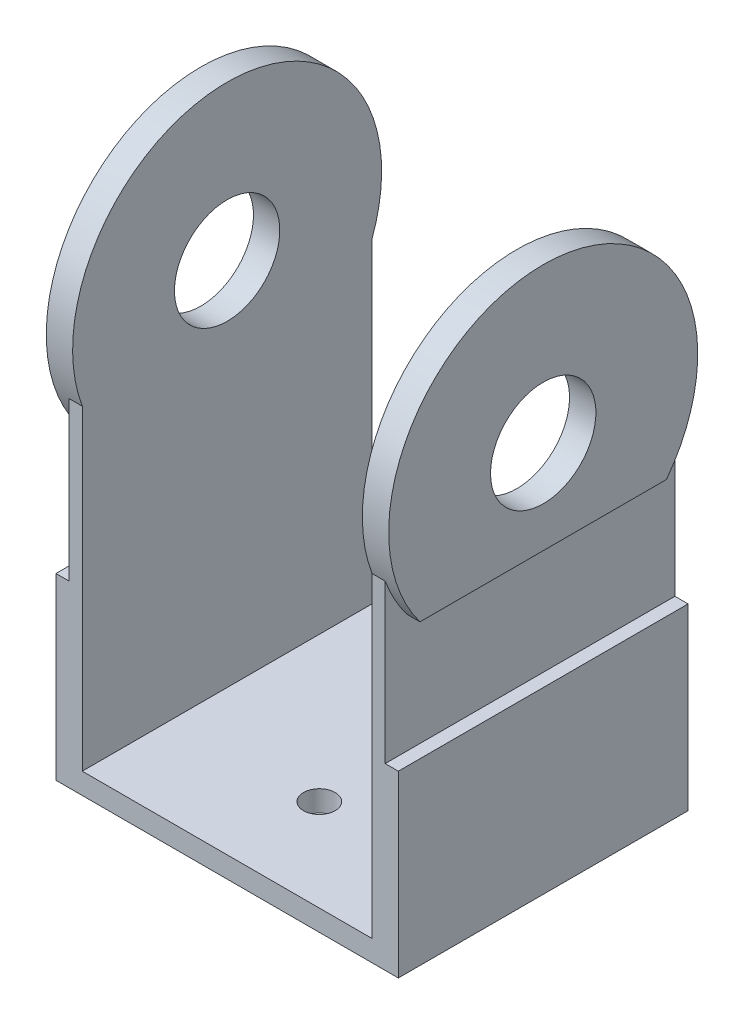
ISO-10303-21;
HEADER;
FILE_DESCRIPTION(('STEP AP214'),'2;1');
FILE_NAME('part.step','',(''),(''),'','','');
FILE_SCHEMA(('AUTOMOTIVE_DESIGN { 1 0 10303 214 1 1 1 1 }'));
ENDSEC;
DATA;
#1=APPLICATION_CONTEXT('core data for automotive mechanical design processes');
#2=APPLICATION_PROTOCOL_DEFINITION('international standard','automotive_design',2000,#1);
#3=PRODUCT_CONTEXT('',#1,'mechanical');
#4=PRODUCT('Part','Part','',(#3));
#5=PRODUCT_RELATED_PRODUCT_CATEGORY('part','',(#4));
#6=PRODUCT_DEFINITION_FORMATION('','',#4);
#7=PRODUCT_DEFINITION_CONTEXT('part definition',#1,'design');
#8=PRODUCT_DEFINITION('design','',#6,#7);
#9=PRODUCT_DEFINITION_SHAPE('','',#8);
#10=(LENGTH_UNIT() NAMED_UNIT(*) SI_UNIT(.MILLI.,.METRE.));
#11=(NAMED_UNIT(*) PLANE_ANGLE_UNIT() SI_UNIT($,.RADIAN.));
#12=(NAMED_UNIT(*) SI_UNIT($,.STERADIAN.) SOLID_ANGLE_UNIT());
#13=UNCERTAINTY_MEASURE_WITH_UNIT(LENGTH_MEASURE(1.E-05),#10,'distance_accuracy_value','');
#14=(GEOMETRIC_REPRESENTATION_CONTEXT(3) GLOBAL_UNCERTAINTY_ASSIGNED_CONTEXT((#13)) GLOBAL_UNIT_ASSIGNED_CONTEXT((#10,
#11,#12)) REPRESENTATION_CONTEXT('',''));
#15=CARTESIAN_POINT('',(0.,0.,0.));
#16=DIRECTION('',(0.,0.,1.));
#17=DIRECTION('',(1.,0.,0.));
#18=AXIS2_PLACEMENT_3D('',#15,#16,#17);
#19=CARTESIAN_POINT('',(30.,64.,0.));
#20=DIRECTION('',(1.,0.,0.));
#21=DIRECTION('',(0.,0.,-1.));
#22=AXIS2_PLACEMENT_3D('',#19,#20,#21);
#23=PLANE('',#22);
#24=DIRECTION('',(0.,0.,1.));
#25=VECTOR('',#24,1.);
#26=CARTESIAN_POINT('',(30.,56.500283137916,0.));
#27=LINE('',#26,#25);
#28=CARTESIAN_POINT('',(30.,56.500283137916,-23.388987302486));
#29=VERTEX_POINT('',#28);
#30=CARTESIAN_POINT('',(30.,56.500283137916,23.388987302486));
#31=VERTEX_POINT('',#30);
#32=EDGE_CURVE('E11',#29,#31,#27,.T.);
#33=ORIENTED_EDGE('',*,*,#32,.T.);
#34=CARTESIAN_POINT('',(30.,74.1976863104014,0.));
#35=DIRECTION('',(1.,0.,0.));
#36=DIRECTION('',(0.,0.,-1.));
#37=AXIS2_PLACEMENT_3D('',#34,#35,#36);
#38=CIRCLE('',#37,29.3298961144657);
#39=CARTESIAN_POINT('',(30.,64.,27.5));
#40=VERTEX_POINT('',#39);
#41=EDGE_CURVE('E173',#31,#40,#38,.F.);
#42=ORIENTED_EDGE('',*,*,#41,.T.);
#43=DIRECTION('',(0.,-1.,0.));
#44=VECTOR('',#43,1.);
#45=CARTESIAN_POINT('',(30.,64.,27.5));
#46=LINE('',#45,#44);
#47=CARTESIAN_POINT('',(30.,34.,27.5));
#48=VERTEX_POINT('',#47);
#49=EDGE_CURVE('E233',#40,#48,#46,.T.);
#50=ORIENTED_EDGE('',*,*,#49,.T.);
#51=DIRECTION('',(0.,0.,1.));
#52=VECTOR('',#51,1.);
#53=CARTESIAN_POINT('',(30.,34.,0.));
#54=LINE('',#53,#52);
#55=CARTESIAN_POINT('',(30.,34.,-27.5));
#56=VERTEX_POINT('',#55);
#57=EDGE_CURVE('E202',#56,#48,#54,.T.);
#58=ORIENTED_EDGE('',*,*,#57,.F.);
#59=DIRECTION('',(0.,-1.,0.));
#60=VECTOR('',#59,1.);
#61=CARTESIAN_POINT('',(30.,64.,-27.5));
#62=LINE('',#61,#60);
#63=CARTESIAN_POINT('',(30.,64.,-27.5));
#64=VERTEX_POINT('',#63);
#65=EDGE_CURVE('E229',#64,#56,#62,.T.);
#66=ORIENTED_EDGE('',*,*,#65,.F.);
#67=EDGE_CURVE('E55',#64,#29,#38,.F.);
#68=ORIENTED_EDGE('',*,*,#67,.T.);
#69=EDGE_LOOP('',(#33,#42,#50,#58,#66,#68));
#70=FACE_BOUND('',#69,.T.);
#71=ADVANCED_FACE('F35',(#70),#23,.T.);
#72=CARTESIAN_POINT('',(0.,4.,0.));
#73=DIRECTION('',(0.,-1.,0.));
#74=DIRECTION('',(0.,0.,-1.));
#75=AXIS2_PLACEMENT_3D('',#72,#73,#74);
#76=PLANE('',#75);
#77=CARTESIAN_POINT('',(0.,4.,-10.));
#78=DIRECTION('',(0.,-1.,0.));
#79=DIRECTION('',(0.,0.,-1.));
#80=AXIS2_PLACEMENT_3D('',#77,#78,#79);
#81=CIRCLE('',#80,3.);
#82=CARTESIAN_POINT('',(0.,4.00000000000002,-13.));
#83=VERTEX_POINT('',#82);
#84=EDGE_CURVE('E286',#83,#83,#81,.T.);
#85=ORIENTED_EDGE('',*,*,#84,.T.);
#86=EDGE_LOOP('',(#85));
#87=FACE_BOUND('',#86,.T.);
#88=CARTESIAN_POINT('',(0.,4.,10.));
#89=DIRECTION('',(0.,-1.,0.));
#90=DIRECTION('',(0.,0.,-1.));
#91=AXIS2_PLACEMENT_3D('',#88,#89,#90);
#92=CIRCLE('',#91,3.);
#93=CARTESIAN_POINT('',(0.,4.00000000000002,7.));
#94=VERTEX_POINT('',#93);
#95=EDGE_CURVE('E285',#94,#94,#92,.T.);
#96=ORIENTED_EDGE('',*,*,#95,.T.);
#97=EDGE_LOOP('',(#96));
#98=FACE_BOUND('',#97,.T.);
#99=DIRECTION('',(0.,0.,1.));
#100=VECTOR('',#99,1.);
#101=CARTESIAN_POINT('',(27.5,4.,0.));
#102=LINE('',#101,#100);
#103=CARTESIAN_POINT('',(27.5,4.,-27.5));
#104=VERTEX_POINT('',#103);
#105=CARTESIAN_POINT('',(27.5,4.,27.5));
#106=VERTEX_POINT('',#105);
#107=EDGE_CURVE('E222',#104,#106,#102,.T.);
#108=ORIENTED_EDGE('',*,*,#107,.F.);
#109=DIRECTION('',(-1.,0.,0.));
#110=VECTOR('',#109,1.);
#111=CARTESIAN_POINT('',(32.5,4.,-27.5));
#112=LINE('',#111,#110);
#113=CARTESIAN_POINT('',(-27.5,4.,-27.5));
#114=VERTEX_POINT('',#113);
#115=EDGE_CURVE('E263',#104,#114,#112,.T.);
#116=ORIENTED_EDGE('',*,*,#115,.T.);
#117=DIRECTION('',(0.,0.,1.));
#118=VECTOR('',#117,1.);
#119=CARTESIAN_POINT('',(-27.5,4.,0.));
#120=LINE('',#119,#118);
#121=CARTESIAN_POINT('',(-27.5,4.,27.5));
#122=VERTEX_POINT('',#121);
#123=EDGE_CURVE('E240',#114,#122,#120,.T.);
#124=ORIENTED_EDGE('',*,*,#123,.T.);
#125=DIRECTION('',(1.,0.,0.));
#126=VECTOR('',#125,1.);
#127=CARTESIAN_POINT('',(32.5,4.,27.5));
#128=LINE('',#127,#126);
#129=EDGE_CURVE('E260',#122,#106,#128,.T.);
#130=ORIENTED_EDGE('',*,*,#129,.T.);
#131=EDGE_LOOP('',(#108,#116,#124,#130));
#132=FACE_BOUND('',#131,.T.);
#133=ADVANCED_FACE('F313',(#87,#98,#132),#76,.F.);
#134=CARTESIAN_POINT('',(-32.5,4.,-27.5));
#135=DIRECTION('',(1.,0.,0.));
#136=DIRECTION('',(0.,0.,-1.));
#137=AXIS2_PLACEMENT_3D('',#134,#135,#136);
#138=PLANE('',#137);
#139=DIRECTION('',(0.,0.,1.));
#140=VECTOR('',#139,1.);
#141=CARTESIAN_POINT('',(-32.5,0.,-27.5));
#142=LINE('',#141,#140);
#143=CARTESIAN_POINT('',(-32.5,0.,-27.5));
#144=VERTEX_POINT('',#143);
#145=CARTESIAN_POINT('',(-32.5,0.,27.5));
#146=VERTEX_POINT('',#145);
#147=EDGE_CURVE('E259',#144,#146,#142,.T.);
#148=ORIENTED_EDGE('',*,*,#147,.T.);
#149=DIRECTION('',(0.,-1.,0.));
#150=VECTOR('',#149,1.);
#151=CARTESIAN_POINT('',(-32.5,4.,27.5));
#152=LINE('',#151,#150);
#153=CARTESIAN_POINT('',(-32.5,34.,27.5));
#154=VERTEX_POINT('',#153);
#155=EDGE_CURVE('E44',#154,#146,#152,.T.);
#156=ORIENTED_EDGE('',*,*,#155,.F.);
#157=DIRECTION('',(0.,0.,1.));
#158=VECTOR('',#157,1.);
#159=CARTESIAN_POINT('',(-32.5,34.,0.));
#160=LINE('',#159,#158);
#161=CARTESIAN_POINT('',(-32.5,34.,-27.5));
#162=VERTEX_POINT('',#161);
#163=EDGE_CURVE('E217',#162,#154,#160,.T.);
#164=ORIENTED_EDGE('',*,*,#163,.F.);
#165=DIRECTION('',(0.,-1.,0.));
#166=VECTOR('',#165,1.);
#167=CARTESIAN_POINT('',(-32.5,4.,-27.5));
#168=LINE('',#167,#166);
#169=EDGE_CURVE('E266',#162,#144,#168,.T.);
#170=ORIENTED_EDGE('',*,*,#169,.T.);
#171=EDGE_LOOP('',(#148,#156,#164,#170));
#172=FACE_BOUND('',#171,.T.);
#173=ADVANCED_FACE('F37',(#172),#138,.F.);
#174=CARTESIAN_POINT('',(32.5,4.,27.5));
#175=DIRECTION('',(0.,0.,-1.));
#176=DIRECTION('',(-1.,0.,0.));
#177=AXIS2_PLACEMENT_3D('',#174,#175,#176);
#178=PLANE('',#177);
#179=DIRECTION('',(0.,-1.,0.));
#180=VECTOR('',#179,1.);
#181=CARTESIAN_POINT('',(32.5,4.,27.5));
#182=LINE('',#181,#180);
#183=CARTESIAN_POINT('',(32.5,34.,27.5));
#184=VERTEX_POINT('',#183);
#185=CARTESIAN_POINT('',(32.5,0.,27.5));
#186=VERTEX_POINT('',#185);
#187=EDGE_CURVE('E279',#184,#186,#182,.T.);
#188=ORIENTED_EDGE('',*,*,#187,.F.);
#189=DIRECTION('',(1.,0.,0.));
#190=VECTOR('',#189,1.);
#191=CARTESIAN_POINT('',(0.,34.,27.5));
#192=LINE('',#191,#190);
#193=EDGE_CURVE('E205',#48,#184,#192,.T.);
#194=ORIENTED_EDGE('',*,*,#193,.F.);
#195=ORIENTED_EDGE('',*,*,#49,.F.);
#196=DIRECTION('',(1.,0.,0.));
#197=VECTOR('',#196,1.);
#198=CARTESIAN_POINT('',(0.,64.,27.5));
#199=LINE('',#198,#197);
#200=CARTESIAN_POINT('',(27.5,64.,27.5));
#201=VERTEX_POINT('',#200);
#202=EDGE_CURVE('E226',#201,#40,#199,.T.);
#203=ORIENTED_EDGE('',*,*,#202,.F.);
#204=DIRECTION('',(0.,-1.,0.));
#205=VECTOR('',#204,1.);
#206=CARTESIAN_POINT('',(27.5,64.,27.5));
#207=LINE('',#206,#205);
#208=EDGE_CURVE('E235',#201,#106,#207,.T.);
#209=ORIENTED_EDGE('',*,*,#208,.T.);
#210=ORIENTED_EDGE('',*,*,#129,.F.);
#211=DIRECTION('',(0.,-1.,0.));
#212=VECTOR('',#211,1.);
#213=CARTESIAN_POINT('',(-27.5,64.,27.5));
#214=LINE('',#213,#212);
#215=CARTESIAN_POINT('',(-27.5,64.,27.5));
#216=VERTEX_POINT('',#215);
#217=EDGE_CURVE('E250',#216,#122,#214,.T.);
#218=ORIENTED_EDGE('',*,*,#217,.F.);
#219=DIRECTION('',(1.,0.,0.));
#220=VECTOR('',#219,1.);
#221=CARTESIAN_POINT('',(0.,64.,27.5));
#222=LINE('',#221,#220);
#223=CARTESIAN_POINT('',(-30.,64.,27.5));
#224=VERTEX_POINT('',#223);
#225=EDGE_CURVE('E243',#224,#216,#222,.T.);
#226=ORIENTED_EDGE('',*,*,#225,.F.);
#227=DIRECTION('',(0.,-1.,0.));
#228=VECTOR('',#227,1.);
#229=CARTESIAN_POINT('',(-30.,64.,27.5));
#230=LINE('',#229,#228);
#231=CARTESIAN_POINT('',(-30.,34.,27.5));
#232=VERTEX_POINT('',#231);
#233=EDGE_CURVE('E253',#224,#232,#230,.T.);
#234=ORIENTED_EDGE('',*,*,#233,.T.);
#235=DIRECTION('',(1.,0.,0.));
#236=VECTOR('',#235,1.);
#237=CARTESIAN_POINT('',(0.,34.,27.5));
#238=LINE('',#237,#236);
#239=EDGE_CURVE('E220',#154,#232,#238,.T.);
#240=ORIENTED_EDGE('',*,*,#239,.F.);
#241=ORIENTED_EDGE('',*,*,#155,.T.);
#242=DIRECTION('',(1.,0.,0.));
#243=VECTOR('',#242,1.);
#244=CARTESIAN_POINT('',(32.5,0.,27.5));
#245=LINE('',#244,#243);
#246=EDGE_CURVE('E269',#146,#186,#245,.T.);
#247=ORIENTED_EDGE('',*,*,#246,.T.);
#248=EDGE_LOOP('',(#188,#194,#195,#203,#209,#210,#218,#226,#234,#240,#241,#247));
#249=FACE_BOUND('',#248,.T.);
#250=ADVANCED_FACE('F346',(#249),#178,.F.);
#251=CARTESIAN_POINT('',(32.5,4.,-27.5));
#252=DIRECTION('',(-1.,0.,0.));
#253=DIRECTION('',(0.,0.,1.));
#254=AXIS2_PLACEMENT_3D('',#251,#252,#253);
#255=PLANE('',#254);
#256=DIRECTION('',(0.,0.,-1.));
#257=VECTOR('',#256,1.);
#258=CARTESIAN_POINT('',(32.5,0.,-27.5));
#259=LINE('',#258,#257);
#260=CARTESIAN_POINT('',(32.5,0.,-27.5));
#261=VERTEX_POINT('',#260);
#262=EDGE_CURVE('E271',#186,#261,#259,.T.);
#263=ORIENTED_EDGE('',*,*,#262,.T.);
#264=DIRECTION('',(0.,-1.,0.));
#265=VECTOR('',#264,1.);
#266=CARTESIAN_POINT('',(32.5,4.,-27.5));
#267=LINE('',#266,#265);
#268=CARTESIAN_POINT('',(32.5,34.,-27.5));
#269=VERTEX_POINT('',#268);
#270=EDGE_CURVE('E276',#269,#261,#267,.T.);
#271=ORIENTED_EDGE('',*,*,#270,.F.);
#272=DIRECTION('',(0.,0.,-1.));
#273=VECTOR('',#272,1.);
#274=CARTESIAN_POINT('',(32.5,34.,0.));
#275=LINE('',#274,#273);
#276=EDGE_CURVE('E208',#184,#269,#275,.T.);
#277=ORIENTED_EDGE('',*,*,#276,.F.);
#278=ORIENTED_EDGE('',*,*,#187,.T.);
#279=EDGE_LOOP('',(#263,#271,#277,#278));
#280=FACE_BOUND('',#279,.T.);
#281=ADVANCED_FACE('F343',(#280),#255,.F.);
#282=CARTESIAN_POINT('',(32.5,4.,-27.5));
#283=DIRECTION('',(0.,0.,1.));
#284=DIRECTION('',(1.,0.,0.));
#285=AXIS2_PLACEMENT_3D('',#282,#283,#284);
#286=PLANE('',#285);
#287=ORIENTED_EDGE('',*,*,#169,.F.);
#288=DIRECTION('',(-1.,0.,0.));
#289=VECTOR('',#288,1.);
#290=CARTESIAN_POINT('',(0.,34.,-27.5));
#291=LINE('',#290,#289);
#292=CARTESIAN_POINT('',(-30.,34.,-27.5));
#293=VERTEX_POINT('',#292);
#294=EDGE_CURVE('E214',#293,#162,#291,.T.);
#295=ORIENTED_EDGE('',*,*,#294,.F.);
#296=DIRECTION('',(0.,-1.,0.));
#297=VECTOR('',#296,1.);
#298=CARTESIAN_POINT('',(-30.,64.,-27.5));
#299=LINE('',#298,#297);
#300=CARTESIAN_POINT('',(-30.,64.,-27.5));
#301=VERTEX_POINT('',#300);
#302=EDGE_CURVE('E256',#301,#293,#299,.T.);
#303=ORIENTED_EDGE('',*,*,#302,.F.);
#304=DIRECTION('',(-1.,0.,0.));
#305=VECTOR('',#304,1.);
#306=CARTESIAN_POINT('',(0.,64.,-27.5));
#307=LINE('',#306,#305);
#308=CARTESIAN_POINT('',(-27.5,64.,-27.5));
#309=VERTEX_POINT('',#308);
#310=EDGE_CURVE('E241',#309,#301,#307,.T.);
#311=ORIENTED_EDGE('',*,*,#310,.F.);
#312=DIRECTION('',(0.,-1.,0.));
#313=VECTOR('',#312,1.);
#314=CARTESIAN_POINT('',(-27.5,64.,-27.5));
#315=LINE('',#314,#313);
#316=EDGE_CURVE('E246',#309,#114,#315,.T.);
#317=ORIENTED_EDGE('',*,*,#316,.T.);
#318=ORIENTED_EDGE('',*,*,#115,.F.);
#319=DIRECTION('',(0.,-1.,0.));
#320=VECTOR('',#319,1.);
#321=CARTESIAN_POINT('',(27.5,64.,-27.5));
#322=LINE('',#321,#320);
#323=CARTESIAN_POINT('',(27.5,64.,-27.5));
#324=VERTEX_POINT('',#323);
#325=EDGE_CURVE('E238',#324,#104,#322,.T.);
#326=ORIENTED_EDGE('',*,*,#325,.F.);
#327=DIRECTION('',(-1.,0.,0.));
#328=VECTOR('',#327,1.);
#329=CARTESIAN_POINT('',(0.,64.,-27.5));
#330=LINE('',#329,#328);
#331=EDGE_CURVE('E223',#64,#324,#330,.T.);
#332=ORIENTED_EDGE('',*,*,#331,.F.);
#333=ORIENTED_EDGE('',*,*,#65,.T.);
#334=DIRECTION('',(-1.,0.,0.));
#335=VECTOR('',#334,1.);
#336=CARTESIAN_POINT('',(0.,34.,-27.5));
#337=LINE('',#336,#335);
#338=EDGE_CURVE('E199',#269,#56,#337,.T.);
#339=ORIENTED_EDGE('',*,*,#338,.F.);
#340=ORIENTED_EDGE('',*,*,#270,.T.);
#341=DIRECTION('',(-1.,0.,0.));
#342=VECTOR('',#341,1.);
#343=CARTESIAN_POINT('',(32.5,0.,-27.5));
#344=LINE('',#343,#342);
#345=EDGE_CURVE('E264',#261,#144,#344,.T.);
#346=ORIENTED_EDGE('',*,*,#345,.T.);
#347=EDGE_LOOP('',(#287,#295,#303,#311,#317,#318,#326,#332,#333,#339,#340,#346));
#348=FACE_BOUND('',#347,.T.);
#349=ADVANCED_FACE('F339',(#348),#286,.F.);
#350=CARTESIAN_POINT('',(0.,0.,0.));
#351=DIRECTION('',(0.,-1.,0.));
#352=DIRECTION('',(0.,0.,-1.));
#353=AXIS2_PLACEMENT_3D('',#350,#351,#352);
#354=PLANE('',#353);
#355=CARTESIAN_POINT('',(0.,0.,-10.));
#356=DIRECTION('',(0.,-1.,0.));
#357=DIRECTION('',(0.,0.,-1.));
#358=AXIS2_PLACEMENT_3D('',#355,#356,#357);
#359=CIRCLE('',#358,3.);
#360=CARTESIAN_POINT('',(0.,0.,-13.));
#361=VERTEX_POINT('',#360);
#362=EDGE_CURVE('E39',#361,#361,#359,.T.);
#363=ORIENTED_EDGE('',*,*,#362,.F.);
#364=EDGE_LOOP('',(#363));
#365=FACE_BOUND('',#364,.T.);
#366=CARTESIAN_POINT('',(0.,0.,10.));
#367=DIRECTION('',(0.,-1.,0.));
#368=DIRECTION('',(0.,0.,-1.));
#369=AXIS2_PLACEMENT_3D('',#366,#367,#368);
#370=CIRCLE('',#369,3.);
#371=CARTESIAN_POINT('',(0.,0.,7.));
#372=VERTEX_POINT('',#371);
#373=EDGE_CURVE('E283',#372,#372,#370,.T.);
#374=ORIENTED_EDGE('',*,*,#373,.F.);
#375=EDGE_LOOP('',(#374));
#376=FACE_BOUND('',#375,.T.);
#377=ORIENTED_EDGE('',*,*,#147,.F.);
#378=ORIENTED_EDGE('',*,*,#345,.F.);
#379=ORIENTED_EDGE('',*,*,#262,.F.);
#380=ORIENTED_EDGE('',*,*,#246,.F.);
#381=EDGE_LOOP('',(#377,#378,#379,#380));
#382=FACE_BOUND('',#381,.T.);
#383=ADVANCED_FACE('F334',(#365,#376,#382),#354,.T.);
#384=CARTESIAN_POINT('',(-30.,64.,0.));
#385=DIRECTION('',(1.,0.,0.));
#386=DIRECTION('',(0.,0.,-1.));
#387=AXIS2_PLACEMENT_3D('',#384,#385,#386);
#388=PLANE('',#387);
#389=DIRECTION('',(0.,0.,-1.));
#390=VECTOR('',#389,1.);
#391=CARTESIAN_POINT('',(-30.,56.500283137916,0.));
#392=LINE('',#391,#390);
#393=CARTESIAN_POINT('',(-30.,56.500283137916,23.388987302486));
#394=VERTEX_POINT('',#393);
#395=CARTESIAN_POINT('',(-30.,56.500283137916,-23.388987302486));
#396=VERTEX_POINT('',#395);
#397=EDGE_CURVE('E196',#394,#396,#392,.T.);
#398=ORIENTED_EDGE('',*,*,#397,.T.);
#399=CARTESIAN_POINT('',(-30.,74.1976863104014,0.));
#400=DIRECTION('',(1.,0.,0.));
#401=DIRECTION('',(0.,0.,-1.));
#402=AXIS2_PLACEMENT_3D('',#399,#400,#401);
#403=CIRCLE('',#402,29.3298961144657);
#404=EDGE_CURVE('E195',#396,#301,#403,.T.);
#405=ORIENTED_EDGE('',*,*,#404,.T.);
#406=ORIENTED_EDGE('',*,*,#302,.T.);
#407=DIRECTION('',(0.,0.,1.));
#408=VECTOR('',#407,1.);
#409=CARTESIAN_POINT('',(-30.,34.,0.));
#410=LINE('',#409,#408);
#411=EDGE_CURVE('E211',#293,#232,#410,.T.);
#412=ORIENTED_EDGE('',*,*,#411,.T.);
#413=ORIENTED_EDGE('',*,*,#233,.F.);
#414=EDGE_CURVE('E191',#224,#394,#403,.T.);
#415=ORIENTED_EDGE('',*,*,#414,.T.);
#416=EDGE_LOOP('',(#398,#405,#406,#412,#413,#415));
#417=FACE_BOUND('',#416,.T.);
#418=ADVANCED_FACE('F331',(#417),#388,.F.);
#419=CARTESIAN_POINT('',(-27.5,64.,0.));
#420=DIRECTION('',(1.,0.,0.));
#421=DIRECTION('',(0.,0.,-1.));
#422=AXIS2_PLACEMENT_3D('',#419,#420,#421);
#423=PLANE('',#422);
#424=ORIENTED_EDGE('',*,*,#316,.F.);
#425=CARTESIAN_POINT('',(-27.5,74.1976863104014,0.));
#426=DIRECTION('',(-1.,0.,0.));
#427=DIRECTION('',(0.,0.,1.));
#428=AXIS2_PLACEMENT_3D('',#425,#426,#427);
#429=CIRCLE('',#428,29.3298961144657);
#430=EDGE_CURVE('E186',#216,#309,#429,.T.);
#431=ORIENTED_EDGE('',*,*,#430,.F.);
#432=ORIENTED_EDGE('',*,*,#217,.T.);
#433=ORIENTED_EDGE('',*,*,#123,.F.);
#434=EDGE_LOOP('',(#424,#431,#432,#433));
#435=FACE_BOUND('',#434,.T.);
#436=CARTESIAN_POINT('',(-27.5,74.1976863104014,0.));
#437=DIRECTION('',(-1.,0.,0.));
#438=DIRECTION('',(0.,0.,1.));
#439=AXIS2_PLACEMENT_3D('',#436,#437,#438);
#440=CIRCLE('',#439,10.);
#441=CARTESIAN_POINT('',(-27.5,74.1976863104014,10.));
#442=VERTEX_POINT('',#441);
#443=EDGE_CURVE('E183',#442,#442,#440,.T.);
#444=ORIENTED_EDGE('',*,*,#443,.T.);
#445=EDGE_LOOP('',(#444));
#446=FACE_BOUND('',#445,.T.);
#447=ADVANCED_FACE('F327',(#435,#446),#423,.T.);
#448=CARTESIAN_POINT('',(27.5,64.,0.));
#449=DIRECTION('',(1.,0.,0.));
#450=DIRECTION('',(0.,0.,-1.));
#451=AXIS2_PLACEMENT_3D('',#448,#449,#450);
#452=PLANE('',#451);
#453=ORIENTED_EDGE('',*,*,#208,.F.);
#454=CARTESIAN_POINT('',(27.5,74.1976863104014,0.));
#455=DIRECTION('',(-1.,0.,0.));
#456=DIRECTION('',(0.,0.,1.));
#457=AXIS2_PLACEMENT_3D('',#454,#455,#456);
#458=CIRCLE('',#457,29.3298961144657);
#459=EDGE_CURVE('E160',#201,#324,#458,.T.);
#460=ORIENTED_EDGE('',*,*,#459,.T.);
#461=ORIENTED_EDGE('',*,*,#325,.T.);
#462=ORIENTED_EDGE('',*,*,#107,.T.);
#463=EDGE_LOOP('',(#453,#460,#461,#462));
#464=FACE_BOUND('',#463,.T.);
#465=CARTESIAN_POINT('',(27.5,74.1976863104014,0.));
#466=DIRECTION('',(-1.,0.,0.));
#467=DIRECTION('',(0.,0.,1.));
#468=AXIS2_PLACEMENT_3D('',#465,#466,#467);
#469=CIRCLE('',#468,10.);
#470=CARTESIAN_POINT('',(27.5,74.1976863104014,10.));
#471=VERTEX_POINT('',#470);
#472=EDGE_CURVE('E163',#471,#471,#469,.T.);
#473=ORIENTED_EDGE('',*,*,#472,.F.);
#474=EDGE_LOOP('',(#473));
#475=FACE_BOUND('',#474,.T.);
#476=ADVANCED_FACE('F324',(#464,#475),#452,.F.);
#477=CARTESIAN_POINT('',(0.,34.,0.));
#478=DIRECTION('',(0.,1.,0.));
#479=DIRECTION('',(0.,0.,1.));
#480=AXIS2_PLACEMENT_3D('',#477,#478,#479);
#481=PLANE('',#480);
#482=ORIENTED_EDGE('',*,*,#411,.F.);
#483=ORIENTED_EDGE('',*,*,#294,.T.);
#484=ORIENTED_EDGE('',*,*,#163,.T.);
#485=ORIENTED_EDGE('',*,*,#239,.T.);
#486=EDGE_LOOP('',(#482,#483,#484,#485));
#487=FACE_BOUND('',#486,.T.);
#488=ADVANCED_FACE('F322',(#487),#481,.T.);
#489=CARTESIAN_POINT('',(0.,34.,0.));
#490=DIRECTION('',(0.,1.,0.));
#491=DIRECTION('',(0.,0.,1.));
#492=AXIS2_PLACEMENT_3D('',#489,#490,#491);
#493=PLANE('',#492);
#494=ORIENTED_EDGE('',*,*,#338,.T.);
#495=ORIENTED_EDGE('',*,*,#57,.T.);
#496=ORIENTED_EDGE('',*,*,#193,.T.);
#497=ORIENTED_EDGE('',*,*,#276,.T.);
#498=EDGE_LOOP('',(#494,#495,#496,#497));
#499=FACE_BOUND('',#498,.T.);
#500=ADVANCED_FACE('F359',(#499),#493,.T.);
#501=CARTESIAN_POINT('',(-27.5,56.500283137916,23.388987302486));
#502=DIRECTION('',(0.,-1.,0.));
#503=DIRECTION('',(0.,0.,-1.));
#504=AXIS2_PLACEMENT_3D('',#501,#502,#503);
#505=PLANE('',#504);
#506=ORIENTED_EDGE('',*,*,#397,.F.);
#507=DIRECTION('',(-1.,0.,0.));
#508=VECTOR('',#507,1.);
#509=CARTESIAN_POINT('',(-27.5,56.500283137916,23.388987302486));
#510=LINE('',#509,#508);
#511=CARTESIAN_POINT('',(-32.5,56.500283137916,23.388987302486));
#512=VERTEX_POINT('',#511);
#513=EDGE_CURVE('E189',#394,#512,#510,.T.);
#514=ORIENTED_EDGE('',*,*,#513,.T.);
#515=DIRECTION('',(0.,0.,1.));
#516=VECTOR('',#515,1.);
#517=CARTESIAN_POINT('',(-32.5,56.500283137916,23.388987302486));
#518=LINE('',#517,#516);
#519=CARTESIAN_POINT('',(-32.5,56.500283137916,-23.388987302486));
#520=VERTEX_POINT('',#519);
#521=EDGE_CURVE('E180',#520,#512,#518,.T.);
#522=ORIENTED_EDGE('',*,*,#521,.F.);
#523=DIRECTION('',(-1.,0.,0.));
#524=VECTOR('',#523,1.);
#525=CARTESIAN_POINT('',(-27.5,56.500283137916,-23.388987302486));
#526=LINE('',#525,#524);
#527=EDGE_CURVE('E188',#396,#520,#526,.T.);
#528=ORIENTED_EDGE('',*,*,#527,.F.);
#529=EDGE_LOOP('',(#506,#514,#522,#528));
#530=FACE_BOUND('',#529,.T.);
#531=ADVANCED_FACE('F394',(#530),#505,.T.);
#532=CARTESIAN_POINT('',(-27.5,74.1976863104014,0.));
#533=DIRECTION('',(-1.,0.,0.));
#534=DIRECTION('',(0.,0.,1.));
#535=AXIS2_PLACEMENT_3D('',#532,#533,#534);
#536=CYLINDRICAL_SURFACE('',#535,29.3298961144657);
#537=ORIENTED_EDGE('',*,*,#404,.F.);
#538=ORIENTED_EDGE('',*,*,#527,.T.);
#539=CARTESIAN_POINT('',(-32.5,74.1976863104014,0.));
#540=DIRECTION('',(-1.,0.,0.));
#541=DIRECTION('',(0.,0.,1.));
#542=AXIS2_PLACEMENT_3D('',#539,#540,#541);
#543=CIRCLE('',#542,29.3298961144657);
#544=EDGE_CURVE('E177',#512,#520,#543,.T.);
#545=ORIENTED_EDGE('',*,*,#544,.F.);
#546=ORIENTED_EDGE('',*,*,#513,.F.);
#547=ORIENTED_EDGE('',*,*,#414,.F.);
#548=ORIENTED_EDGE('',*,*,#225,.T.);
#549=ORIENTED_EDGE('',*,*,#430,.T.);
#550=ORIENTED_EDGE('',*,*,#310,.T.);
#551=EDGE_LOOP('',(#537,#538,#545,#546,#547,#548,#549,#550));
#552=FACE_BOUND('',#551,.T.);
#553=ADVANCED_FACE('F376',(#552),#536,.T.);
#554=CARTESIAN_POINT('',(-27.5,74.1976863104014,0.));
#555=DIRECTION('',(-1.,0.,0.));
#556=DIRECTION('',(0.,0.,1.));
#557=AXIS2_PLACEMENT_3D('',#554,#555,#556);
#558=CYLINDRICAL_SURFACE('',#557,10.);
#559=ORIENTED_EDGE('',*,*,#443,.F.);
#560=EDGE_LOOP('',(#559));
#561=FACE_BOUND('',#560,.T.);
#562=CARTESIAN_POINT('',(-32.5,74.1976863104014,0.));
#563=DIRECTION('',(-1.,0.,0.));
#564=DIRECTION('',(0.,0.,1.));
#565=AXIS2_PLACEMENT_3D('',#562,#563,#564);
#566=CIRCLE('',#565,10.);
#567=CARTESIAN_POINT('',(-32.5,74.1976863104014,10.));
#568=VERTEX_POINT('',#567);
#569=EDGE_CURVE('E174',#568,#568,#566,.T.);
#570=ORIENTED_EDGE('',*,*,#569,.T.);
#571=EDGE_LOOP('',(#570));
#572=FACE_BOUND('',#571,.T.);
#573=ADVANCED_FACE('F399',(#561,#572),#558,.F.);
#574=CARTESIAN_POINT('',(-32.5,74.1976863104014,0.));
#575=DIRECTION('',(-1.,0.,0.));
#576=DIRECTION('',(0.,0.,1.));
#577=AXIS2_PLACEMENT_3D('',#574,#575,#576);
#578=PLANE('',#577);
#579=ORIENTED_EDGE('',*,*,#544,.T.);
#580=ORIENTED_EDGE('',*,*,#521,.T.);
#581=EDGE_LOOP('',(#579,#580));
#582=FACE_BOUND('',#581,.T.);
#583=ORIENTED_EDGE('',*,*,#569,.F.);
#584=EDGE_LOOP('',(#583));
#585=FACE_BOUND('',#584,.T.);
#586=ADVANCED_FACE('F396',(#582,#585),#578,.T.);
#587=CARTESIAN_POINT('',(32.5,74.1976863104014,0.));
#588=DIRECTION('',(-1.,0.,0.));
#589=DIRECTION('',(0.,0.,1.));
#590=AXIS2_PLACEMENT_3D('',#587,#588,#589);
#591=PLANE('',#590);
#592=CARTESIAN_POINT('',(32.5,74.1976863104014,0.));
#593=DIRECTION('',(-1.,0.,0.));
#594=DIRECTION('',(0.,0.,1.));
#595=AXIS2_PLACEMENT_3D('',#592,#593,#594);
#596=CIRCLE('',#595,29.3298961144657);
#597=CARTESIAN_POINT('',(32.5,56.500283137916,23.388987302486));
#598=VERTEX_POINT('',#597);
#599=CARTESIAN_POINT('',(32.5,56.500283137916,-23.388987302486));
#600=VERTEX_POINT('',#599);
#601=EDGE_CURVE('E159',#598,#600,#596,.T.);
#602=ORIENTED_EDGE('',*,*,#601,.F.);
#603=DIRECTION('',(0.,0.,1.));
#604=VECTOR('',#603,1.);
#605=CARTESIAN_POINT('',(32.5,56.500283137916,23.388987302486));
#606=LINE('',#605,#604);
#607=EDGE_CURVE('E150',#600,#598,#606,.T.);
#608=ORIENTED_EDGE('',*,*,#607,.F.);
#609=EDGE_LOOP('',(#602,#608));
#610=FACE_BOUND('',#609,.T.);
#611=CARTESIAN_POINT('',(32.5,74.1976863104014,0.));
#612=DIRECTION('',(-1.,0.,0.));
#613=DIRECTION('',(0.,0.,1.));
#614=AXIS2_PLACEMENT_3D('',#611,#612,#613);
#615=CIRCLE('',#614,10.);
#616=CARTESIAN_POINT('',(32.5,74.1976863104014,10.));
#617=VERTEX_POINT('',#616);
#618=EDGE_CURVE('E166',#617,#617,#615,.T.);
#619=ORIENTED_EDGE('',*,*,#618,.T.);
#620=EDGE_LOOP('',(#619));
#621=FACE_BOUND('',#620,.T.);
#622=ADVANCED_FACE('F157',(#610,#621),#591,.F.);
#623=CARTESIAN_POINT('',(27.5,74.1976863104014,0.));
#624=DIRECTION('',(1.,0.,0.));
#625=DIRECTION('',(0.,0.,-1.));
#626=AXIS2_PLACEMENT_3D('',#623,#624,#625);
#627=CYLINDRICAL_SURFACE('',#626,29.3298961144657);
#628=ORIENTED_EDGE('',*,*,#41,.F.);
#629=DIRECTION('',(1.,0.,0.));
#630=VECTOR('',#629,1.);
#631=CARTESIAN_POINT('',(27.5,56.500283137916,23.388987302486));
#632=LINE('',#631,#630);
#633=EDGE_CURVE('E154',#31,#598,#632,.T.);
#634=ORIENTED_EDGE('',*,*,#633,.T.);
#635=ORIENTED_EDGE('',*,*,#601,.T.);
#636=DIRECTION('',(1.,0.,0.));
#637=VECTOR('',#636,1.);
#638=CARTESIAN_POINT('',(27.5,56.500283137916,-23.388987302486));
#639=LINE('',#638,#637);
#640=EDGE_CURVE('E146',#29,#600,#639,.T.);
#641=ORIENTED_EDGE('',*,*,#640,.F.);
#642=ORIENTED_EDGE('',*,*,#67,.F.);
#643=ORIENTED_EDGE('',*,*,#331,.T.);
#644=ORIENTED_EDGE('',*,*,#459,.F.);
#645=ORIENTED_EDGE('',*,*,#202,.T.);
#646=EDGE_LOOP('',(#628,#634,#635,#641,#642,#643,#644,#645));
#647=FACE_BOUND('',#646,.T.);
#648=ADVANCED_FACE('F162',(#647),#627,.T.);
#649=CARTESIAN_POINT('',(27.5,56.500283137916,23.388987302486));
#650=DIRECTION('',(0.,1.,0.));
#651=DIRECTION('',(0.,0.,1.));
#652=AXIS2_PLACEMENT_3D('',#649,#650,#651);
#653=PLANE('',#652);
#654=ORIENTED_EDGE('',*,*,#32,.F.);
#655=ORIENTED_EDGE('',*,*,#640,.T.);
#656=ORIENTED_EDGE('',*,*,#607,.T.);
#657=ORIENTED_EDGE('',*,*,#633,.F.);
#658=EDGE_LOOP('',(#654,#655,#656,#657));
#659=FACE_BOUND('',#658,.T.);
#660=ADVANCED_FACE('F148',(#659),#653,.F.);
#661=CARTESIAN_POINT('',(27.5,74.1976863104014,0.));
#662=DIRECTION('',(1.,0.,0.));
#663=DIRECTION('',(0.,0.,-1.));
#664=AXIS2_PLACEMENT_3D('',#661,#662,#663);
#665=CYLINDRICAL_SURFACE('',#664,10.);
#666=ORIENTED_EDGE('',*,*,#472,.T.);
#667=EDGE_LOOP('',(#666));
#668=FACE_BOUND('',#667,.T.);
#669=ORIENTED_EDGE('',*,*,#618,.F.);
#670=EDGE_LOOP('',(#669));
#671=FACE_BOUND('',#670,.T.);
#672=ADVANCED_FACE('F299',(#668,#671),#665,.F.);
#673=CARTESIAN_POINT('',(0.,103.527582424867,10.));
#674=DIRECTION('',(0.,-1.,0.));
#675=DIRECTION('',(0.,0.,-1.));
#676=AXIS2_PLACEMENT_3D('',#673,#674,#675);
#677=CYLINDRICAL_SURFACE('',#676,3.);
#678=CARTESIAN_POINT('',(0.,0.,7.));
#679=CARTESIAN_POINT('',(0.,0.0416666666666805,7.));
#680=CARTESIAN_POINT('',(0.,0.0833333333333473,7.));
#681=CARTESIAN_POINT('',(0.,0.166666666666681,7.));
#682=CARTESIAN_POINT('',(0.,0.208333333333347,7.));
#683=CARTESIAN_POINT('',(0.,0.291666666666681,7.));
#684=CARTESIAN_POINT('',(0.,0.333333333333347,7.));
#685=CARTESIAN_POINT('',(0.,0.416666666666681,7.));
#686=CARTESIAN_POINT('',(0.,0.458333333333348,7.));
#687=CARTESIAN_POINT('',(0.,0.541666666666681,7.));
#688=CARTESIAN_POINT('',(0.,0.583333333333348,7.));
#689=CARTESIAN_POINT('',(0.,0.666666666666681,7.));
#690=CARTESIAN_POINT('',(0.,0.708333333333348,7.));
#691=CARTESIAN_POINT('',(0.,0.791666666666681,7.));
#692=CARTESIAN_POINT('',(0.,0.833333333333348,7.));
#693=CARTESIAN_POINT('',(0.,0.916666666666681,7.));
#694=CARTESIAN_POINT('',(0.,0.958333333333348,7.));
#695=CARTESIAN_POINT('',(0.,1.04166666666668,7.));
#696=CARTESIAN_POINT('',(0.,1.08333333333335,7.));
#697=CARTESIAN_POINT('',(0.,1.16666666666668,7.));
#698=CARTESIAN_POINT('',(0.,1.20833333333335,7.));
#699=CARTESIAN_POINT('',(0.,1.29166666666668,7.));
#700=CARTESIAN_POINT('',(0.,1.33333333333335,7.));
#701=CARTESIAN_POINT('',(0.,1.41666666666668,7.));
#702=CARTESIAN_POINT('',(0.,1.45833333333335,7.));
#703=CARTESIAN_POINT('',(0.,1.54166666666668,7.));
#704=CARTESIAN_POINT('',(0.,1.58333333333335,7.));
#705=CARTESIAN_POINT('',(0.,1.66666666666668,7.));
#706=CARTESIAN_POINT('',(0.,1.70833333333335,7.));
#707=CARTESIAN_POINT('',(0.,1.79166666666668,7.));
#708=CARTESIAN_POINT('',(0.,1.83333333333335,7.));
#709=CARTESIAN_POINT('',(0.,1.91666666666668,7.));
#710=CARTESIAN_POINT('',(0.,1.95833333333335,7.));
#711=CARTESIAN_POINT('',(0.,2.04166666666668,7.));
#712=CARTESIAN_POINT('',(0.,2.08333333333335,7.));
#713=CARTESIAN_POINT('',(0.,2.16666666666668,7.));
#714=CARTESIAN_POINT('',(0.,2.20833333333335,7.));
#715=CARTESIAN_POINT('',(0.,2.29166666666668,7.));
#716=CARTESIAN_POINT('',(0.,2.33333333333335,7.));
#717=CARTESIAN_POINT('',(0.,2.41666666666668,7.));
#718=CARTESIAN_POINT('',(0.,2.45833333333335,7.));
#719=CARTESIAN_POINT('',(0.,2.54166666666668,7.));
#720=CARTESIAN_POINT('',(0.,2.58333333333335,7.));
#721=CARTESIAN_POINT('',(0.,2.66666666666668,7.));
#722=CARTESIAN_POINT('',(0.,2.70833333333335,7.));
#723=CARTESIAN_POINT('',(0.,2.79166666666668,7.));
#724=CARTESIAN_POINT('',(0.,2.83333333333335,7.));
#725=CARTESIAN_POINT('',(0.,2.91666666666668,7.));
#726=CARTESIAN_POINT('',(0.,2.95833333333335,7.));
#727=CARTESIAN_POINT('',(0.,3.04166666666668,7.));
#728=CARTESIAN_POINT('',(0.,3.08333333333335,7.));
#729=CARTESIAN_POINT('',(0.,3.16666666666668,7.));
#730=CARTESIAN_POINT('',(0.,3.20833333333335,7.));
#731=CARTESIAN_POINT('',(0.,3.29166666666668,7.));
#732=CARTESIAN_POINT('',(0.,3.33333333333335,7.));
#733=CARTESIAN_POINT('',(0.,3.41666666666668,7.));
#734=CARTESIAN_POINT('',(0.,3.45833333333335,7.));
#735=CARTESIAN_POINT('',(0.,3.54166666666668,7.));
#736=CARTESIAN_POINT('',(0.,3.58333333333335,7.));
#737=CARTESIAN_POINT('',(0.,3.66666666666668,7.));
#738=CARTESIAN_POINT('',(0.,3.70833333333335,7.));
#739=CARTESIAN_POINT('',(0.,3.79166666666668,7.));
#740=CARTESIAN_POINT('',(0.,3.83333333333335,7.));
#741=CARTESIAN_POINT('',(0.,3.91666666666668,7.));
#742=CARTESIAN_POINT('',(0.,3.95833333333335,7.));
#743=CARTESIAN_POINT('',(0.,4.00000000000002,7.));
#744=B_SPLINE_CURVE_WITH_KNOTS('',3,(#678,#679,#680,#681,#682,#683,#684,#685,#686,#687,#688,
#689,#690,#691,#692,#693,#694,#695,#696,#697,#698,#699,#700,#701,#702,#703,#704,#705,#706,#707,
#708,#709,#710,#711,#712,#713,#714,#715,#716,#717,#718,#719,#720,#721,#722,#723,#724,#725,#726,
#727,#728,#729,#730,#731,#732,#733,#734,#735,#736,#737,#738,#739,#740,#741,#742,#743),
.UNSPECIFIED.,.F.,.F.,(4,2,2,2,2,2,2,2,2,2,2,2,2,2,2,2,2,2,2,2,2,2,2,2,2,2,2,2,2,2,2,2,4),(0.,
0.125,0.25,0.375,0.5,0.625000000000001,0.750000000000001,0.875000000000001,1.,1.125,1.25,1.375,
1.5,1.625,1.75,1.875,2.,2.125,2.25,2.375,2.5,2.625,2.75,2.875,3.,3.125,3.25,3.375,3.5,3.625,
3.75,3.875,4.),.UNSPECIFIED.);
#745=EDGE_CURVE('BSEAM301',#372,#94,#744,.T.);
#746=ORIENTED_EDGE('',*,*,#373,.T.);
#747=ORIENTED_EDGE('',*,*,#95,.F.);
#748=ORIENTED_EDGE('',*,*,#745,.T.);
#749=ORIENTED_EDGE('',*,*,#745,.F.);
#750=EDGE_LOOP('',(#746,#748,#747,#749));
#751=FACE_BOUND('',#750,.T.);
#752=ADVANCED_FACE('F301',(#751),#677,.F.);
#753=CARTESIAN_POINT('',(0.,103.527582424867,-10.));
#754=DIRECTION('',(0.,-1.,0.));
#755=DIRECTION('',(0.,0.,-1.));
#756=AXIS2_PLACEMENT_3D('',#753,#754,#755);
#757=CYLINDRICAL_SURFACE('',#756,3.);
#758=CARTESIAN_POINT('',(0.,0.,-13.));
#759=CARTESIAN_POINT('',(0.,0.0416666666666805,-13.));
#760=CARTESIAN_POINT('',(0.,0.0833333333333473,-13.));
#761=CARTESIAN_POINT('',(0.,0.166666666666681,-13.));
#762=CARTESIAN_POINT('',(0.,0.208333333333347,-13.));
#763=CARTESIAN_POINT('',(0.,0.291666666666681,-13.));
#764=CARTESIAN_POINT('',(0.,0.333333333333347,-13.));
#765=CARTESIAN_POINT('',(0.,0.416666666666681,-13.));
#766=CARTESIAN_POINT('',(0.,0.458333333333348,-13.));
#767=CARTESIAN_POINT('',(0.,0.541666666666681,-13.));
#768=CARTESIAN_POINT('',(0.,0.583333333333348,-13.));
#769=CARTESIAN_POINT('',(0.,0.666666666666681,-13.));
#770=CARTESIAN_POINT('',(0.,0.708333333333348,-13.));
#771=CARTESIAN_POINT('',(0.,0.791666666666681,-13.));
#772=CARTESIAN_POINT('',(0.,0.833333333333348,-13.));
#773=CARTESIAN_POINT('',(0.,0.916666666666681,-13.));
#774=CARTESIAN_POINT('',(0.,0.958333333333348,-13.));
#775=CARTESIAN_POINT('',(0.,1.04166666666668,-13.));
#776=CARTESIAN_POINT('',(0.,1.08333333333335,-13.));
#777=CARTESIAN_POINT('',(0.,1.16666666666668,-13.));
#778=CARTESIAN_POINT('',(0.,1.20833333333335,-13.));
#779=CARTESIAN_POINT('',(0.,1.29166666666668,-13.));
#780=CARTESIAN_POINT('',(0.,1.33333333333335,-13.));
#781=CARTESIAN_POINT('',(0.,1.41666666666668,-13.));
#782=CARTESIAN_POINT('',(0.,1.45833333333335,-13.));
#783=CARTESIAN_POINT('',(0.,1.54166666666668,-13.));
#784=CARTESIAN_POINT('',(0.,1.58333333333335,-13.));
#785=CARTESIAN_POINT('',(0.,1.66666666666668,-13.));
#786=CARTESIAN_POINT('',(0.,1.70833333333335,-13.));
#787=CARTESIAN_POINT('',(0.,1.79166666666668,-13.));
#788=CARTESIAN_POINT('',(0.,1.83333333333335,-13.));
#789=CARTESIAN_POINT('',(0.,1.91666666666668,-13.));
#790=CARTESIAN_POINT('',(0.,1.95833333333335,-13.));
#791=CARTESIAN_POINT('',(0.,2.04166666666668,-13.));
#792=CARTESIAN_POINT('',(0.,2.08333333333335,-13.));
#793=CARTESIAN_POINT('',(0.,2.16666666666668,-13.));
#794=CARTESIAN_POINT('',(0.,2.20833333333335,-13.));
#795=CARTESIAN_POINT('',(0.,2.29166666666668,-13.));
#796=CARTESIAN_POINT('',(0.,2.33333333333335,-13.));
#797=CARTESIAN_POINT('',(0.,2.41666666666668,-13.));
#798=CARTESIAN_POINT('',(0.,2.45833333333335,-13.));
#799=CARTESIAN_POINT('',(0.,2.54166666666668,-13.));
#800=CARTESIAN_POINT('',(0.,2.58333333333335,-13.));
#801=CARTESIAN_POINT('',(0.,2.66666666666668,-13.));
#802=CARTESIAN_POINT('',(0.,2.70833333333335,-13.));
#803=CARTESIAN_POINT('',(0.,2.79166666666668,-13.));
#804=CARTESIAN_POINT('',(0.,2.83333333333335,-13.));
#805=CARTESIAN_POINT('',(0.,2.91666666666668,-13.));
#806=CARTESIAN_POINT('',(0.,2.95833333333335,-13.));
#807=CARTESIAN_POINT('',(0.,3.04166666666668,-13.));
#808=CARTESIAN_POINT('',(0.,3.08333333333335,-13.));
#809=CARTESIAN_POINT('',(0.,3.16666666666668,-13.));
#810=CARTESIAN_POINT('',(0.,3.20833333333335,-13.));
#811=CARTESIAN_POINT('',(0.,3.29166666666668,-13.));
#812=CARTESIAN_POINT('',(0.,3.33333333333335,-13.));
#813=CARTESIAN_POINT('',(0.,3.41666666666668,-13.));
#814=CARTESIAN_POINT('',(0.,3.45833333333335,-13.));
#815=CARTESIAN_POINT('',(0.,3.54166666666668,-13.));
#816=CARTESIAN_POINT('',(0.,3.58333333333335,-13.));
#817=CARTESIAN_POINT('',(0.,3.66666666666668,-13.));
#818=CARTESIAN_POINT('',(0.,3.70833333333335,-13.));
#819=CARTESIAN_POINT('',(0.,3.79166666666668,-13.));
#820=CARTESIAN_POINT('',(0.,3.83333333333335,-13.));
#821=CARTESIAN_POINT('',(0.,3.91666666666668,-13.));
#822=CARTESIAN_POINT('',(0.,3.95833333333335,-13.));
#823=CARTESIAN_POINT('',(0.,4.00000000000002,-13.));
#824=B_SPLINE_CURVE_WITH_KNOTS('',3,(#758,#759,#760,#761,#762,#763,#764,#765,#766,#767,#768,
#769,#770,#771,#772,#773,#774,#775,#776,#777,#778,#779,#780,#781,#782,#783,#784,#785,#786,#787,
#788,#789,#790,#791,#792,#793,#794,#795,#796,#797,#798,#799,#800,#801,#802,#803,#804,#805,#806,
#807,#808,#809,#810,#811,#812,#813,#814,#815,#816,#817,#818,#819,#820,#821,#822,#823),
.UNSPECIFIED.,.F.,.F.,(4,2,2,2,2,2,2,2,2,2,2,2,2,2,2,2,2,2,2,2,2,2,2,2,2,2,2,2,2,2,2,2,4),(0.,
0.125,0.25,0.375,0.5,0.625000000000001,0.750000000000001,0.875000000000001,1.,1.125,1.25,1.375,
1.5,1.625,1.75,1.875,2.,2.125,2.25,2.375,2.5,2.625,2.75,2.875,3.,3.125,3.25,3.375,3.5,3.625,
3.75,3.875,4.),.UNSPECIFIED.);
#825=EDGE_CURVE('BSEAM308',#361,#83,#824,.T.);
#826=ORIENTED_EDGE('',*,*,#362,.T.);
#827=ORIENTED_EDGE('',*,*,#84,.F.);
#828=ORIENTED_EDGE('',*,*,#825,.T.);
#829=ORIENTED_EDGE('',*,*,#825,.F.);
#830=EDGE_LOOP('',(#826,#828,#827,#829));
#831=FACE_BOUND('',#830,.T.);
#832=ADVANCED_FACE('F308',(#831),#757,.F.);
#833=CLOSED_SHELL('',(#71,#133,#173,#250,#281,#349,#383,#418,#447,#476,#488,#500,#531,#553,#573,
#586,#622,#648,#660,#672,#752,#832));
#834=MANIFOLD_SOLID_BREP('B2',#833);
#835=ADVANCED_BREP_SHAPE_REPRESENTATION('',(#18,#834),#14);
#836=SHAPE_DEFINITION_REPRESENTATION(#9,#835);
ENDSEC;
END-ISO-10303-21;
